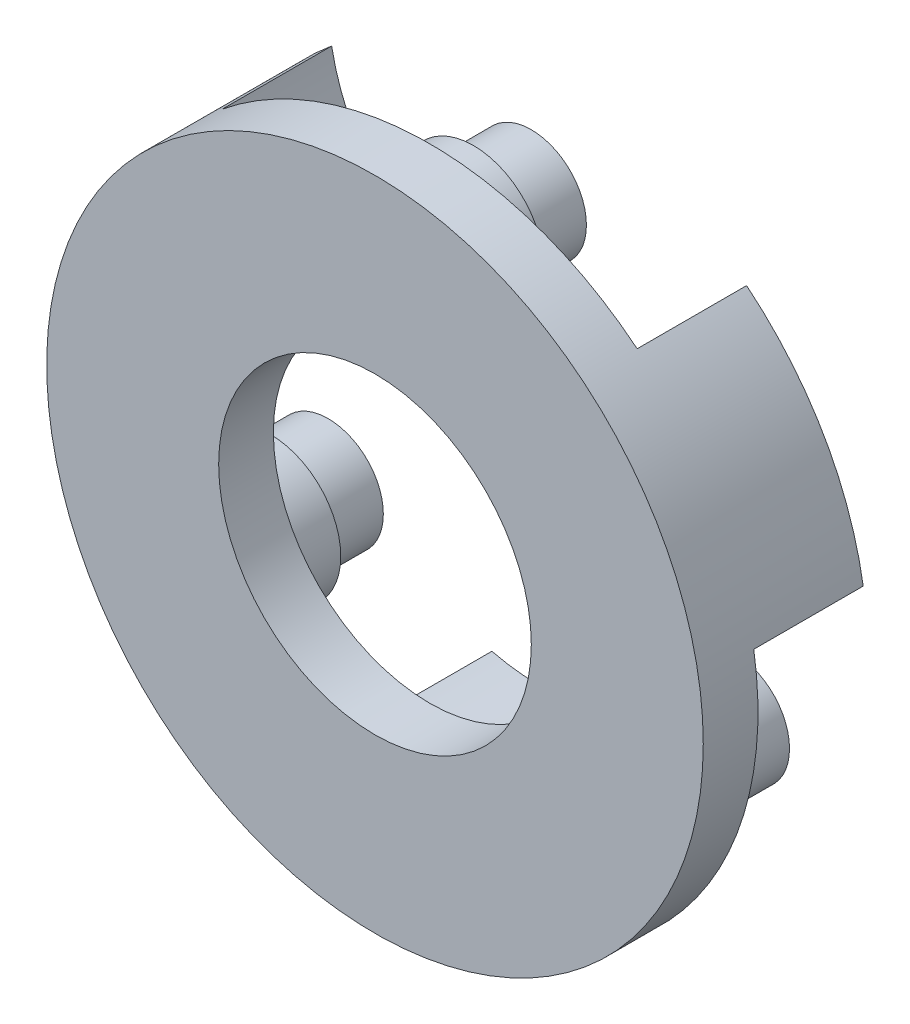
ISO-10303-21;
HEADER;
FILE_DESCRIPTION(('STEP AP214'),'2;1');
FILE_NAME('part.step','',(''),(''),'','','');
FILE_SCHEMA(('AUTOMOTIVE_DESIGN { 1 0 10303 214 1 1 1 1 }'));
ENDSEC;
DATA;
#1=APPLICATION_CONTEXT('core data for automotive mechanical design processes');
#2=APPLICATION_PROTOCOL_DEFINITION('international standard','automotive_design',2000,#1);
#3=PRODUCT_CONTEXT('',#1,'mechanical');
#4=PRODUCT('Part','Part','',(#3));
#5=PRODUCT_RELATED_PRODUCT_CATEGORY('part','',(#4));
#6=PRODUCT_DEFINITION_FORMATION('','',#4);
#7=PRODUCT_DEFINITION_CONTEXT('part definition',#1,'design');
#8=PRODUCT_DEFINITION('design','',#6,#7);
#9=PRODUCT_DEFINITION_SHAPE('','',#8);
#10=(LENGTH_UNIT() NAMED_UNIT(*) SI_UNIT(.MILLI.,.METRE.));
#11=(NAMED_UNIT(*) PLANE_ANGLE_UNIT() SI_UNIT($,.RADIAN.));
#12=(NAMED_UNIT(*) SI_UNIT($,.STERADIAN.) SOLID_ANGLE_UNIT());
#13=UNCERTAINTY_MEASURE_WITH_UNIT(LENGTH_MEASURE(1.E-05),#10,'distance_accuracy_value','');
#14=(GEOMETRIC_REPRESENTATION_CONTEXT(3) GLOBAL_UNCERTAINTY_ASSIGNED_CONTEXT((#13)) GLOBAL_UNIT_ASSIGNED_CONTEXT((#10,
#11,#12)) REPRESENTATION_CONTEXT('',''));
#15=CARTESIAN_POINT('',(0.,0.,0.));
#16=DIRECTION('',(0.,0.,1.));
#17=DIRECTION('',(1.,0.,0.));
#18=AXIS2_PLACEMENT_3D('',#15,#16,#17);
#19=CARTESIAN_POINT('',(0.,0.,0.));
#20=DIRECTION('',(0.,0.,1.));
#21=DIRECTION('',(1.,0.,0.));
#22=AXIS2_PLACEMENT_3D('',#19,#20,#21);
#23=PLANE('',#22);
#24=CARTESIAN_POINT('',(12.9903810567659,-7.50000000000036,0.));
#25=DIRECTION('',(0.,0.,1.));
#26=DIRECTION('',(1.,0.,0.));
#27=AXIS2_PLACEMENT_3D('',#24,#25,#26);
#28=CIRCLE('',#27,4.50000000000084);
#29=CARTESIAN_POINT('',(17.4903810567668,-7.50000000000036,0.));
#30=VERTEX_POINT('',#29);
#31=EDGE_CURVE('E11',#30,#30,#28,.F.);
#32=ORIENTED_EDGE('',*,*,#31,.F.);
#33=EDGE_LOOP('',(#32));
#34=FACE_BOUND('',#33,.T.);
#35=CARTESIAN_POINT('',(-12.9903810567672,-7.49999999999963,0.));
#36=DIRECTION('',(0.,0.,1.));
#37=DIRECTION('',(1.,0.,0.));
#38=AXIS2_PLACEMENT_3D('',#35,#36,#37);
#39=CIRCLE('',#38,4.50000000000057);
#40=CARTESIAN_POINT('',(-8.49038105676664,-7.49999999999963,0.));
#41=VERTEX_POINT('',#40);
#42=EDGE_CURVE('E245',#41,#41,#39,.F.);
#43=ORIENTED_EDGE('',*,*,#42,.F.);
#44=EDGE_LOOP('',(#43));
#45=FACE_BOUND('',#44,.T.);
#46=CARTESIAN_POINT('',(0.,15.,0.));
#47=DIRECTION('',(0.,0.,1.));
#48=DIRECTION('',(1.,0.,0.));
#49=AXIS2_PLACEMENT_3D('',#46,#47,#48);
#50=CIRCLE('',#49,4.5);
#51=CARTESIAN_POINT('',(4.5,15.,0.));
#52=VERTEX_POINT('',#51);
#53=EDGE_CURVE('E239',#52,#52,#50,.F.);
#54=ORIENTED_EDGE('',*,*,#53,.F.);
#55=EDGE_LOOP('',(#54));
#56=FACE_BOUND('',#55,.T.);
#57=CARTESIAN_POINT('',(0.,0.,0.));
#58=DIRECTION('',(0.,0.,-1.));
#59=DIRECTION('',(-1.,0.,0.));
#60=AXIS2_PLACEMENT_3D('',#57,#58,#59);
#61=CIRCLE('',#60,10.);
#62=CARTESIAN_POINT('',(-10.,0.,0.));
#63=VERTEX_POINT('',#62);
#64=EDGE_CURVE('E222',#63,#63,#61,.T.);
#65=ORIENTED_EDGE('',*,*,#64,.F.);
#66=EDGE_LOOP('',(#65));
#67=FACE_BOUND('',#66,.T.);
#68=CARTESIAN_POINT('',(0.,0.,0.));
#69=DIRECTION('',(0.,0.,-1.));
#70=DIRECTION('',(-1.,0.,0.));
#71=AXIS2_PLACEMENT_3D('',#68,#69,#70);
#72=CIRCLE('',#71,12.5);
#73=CARTESIAN_POINT('',(3.02191559121072,-12.1292219931699,0.));
#74=VERTEX_POINT('',#73);
#75=CARTESIAN_POINT('',(-3.02191559121221,-12.1292219931696,0.));
#76=VERTEX_POINT('',#75);
#77=EDGE_CURVE('E159',#74,#76,#72,.T.);
#78=ORIENTED_EDGE('',*,*,#77,.T.);
#79=CARTESIAN_POINT('',(-16.2379763209581,-9.37499999999878,0.));
#80=DIRECTION('',(0.,0.,-1.));
#81=DIRECTION('',(-1.,0.,0.));
#82=AXIS2_PLACEMENT_3D('',#79,#80,#81);
#83=CIRCLE('',#82,13.4999999999999);
#84=CARTESIAN_POINT('',(-7.45897050021628,-19.6306841214692,0.));
#85=VERTEX_POINT('',#84);
#86=EDGE_CURVE('E132',#76,#85,#83,.T.);
#87=ORIENTED_EDGE('',*,*,#86,.T.);
#88=CARTESIAN_POINT('',(0.,0.,0.));
#89=DIRECTION('',(0.,0.,1.));
#90=DIRECTION('',(1.,0.,0.));
#91=AXIS2_PLACEMENT_3D('',#88,#89,#90);
#92=CIRCLE('',#91,21.);
#93=CARTESIAN_POINT('',(-20.7301563929679,3.35568412147083,0.));
#94=VERTEX_POINT('',#93);
#95=EDGE_CURVE('E236',#94,#85,#92,.T.);
#96=ORIENTED_EDGE('',*,*,#95,.F.);
#97=CARTESIAN_POINT('',(-16.2379763209581,-9.37499999999878,0.));
#98=DIRECTION('',(0.,0.,-1.));
#99=DIRECTION('',(-1.,0.,0.));
#100=AXIS2_PLACEMENT_3D('',#97,#98,#99);
#101=CIRCLE('',#100,13.5);
#102=CARTESIAN_POINT('',(-12.0151721698315,3.44755532650412,0.));
#103=VERTEX_POINT('',#102);
#104=EDGE_CURVE('E61',#94,#103,#101,.T.);
#105=ORIENTED_EDGE('',*,*,#104,.T.);
#106=CARTESIAN_POINT('',(0.,0.,0.));
#107=DIRECTION('',(0.,0.,-1.));
#108=DIRECTION('',(-1.,0.,0.));
#109=AXIS2_PLACEMENT_3D('',#106,#107,#108);
#110=CIRCLE('',#109,12.5);
#111=CARTESIAN_POINT('',(-8.99325657861968,8.68166666666682,0.));
#112=VERTEX_POINT('',#111);
#113=EDGE_CURVE('E181',#103,#112,#110,.T.);
#114=ORIENTED_EDGE('',*,*,#113,.T.);
#115=CARTESIAN_POINT('',(1.09807996029332E-12,18.7499999999993,0.));
#116=DIRECTION('',(0.,0.,-1.));
#117=DIRECTION('',(-1.,0.,0.));
#118=AXIS2_PLACEMENT_3D('',#115,#116,#117);
#119=CIRCLE('',#118,13.5);
#120=CARTESIAN_POINT('',(-13.2711858927519,16.2750000000007,0.));
#121=VERTEX_POINT('',#120);
#122=EDGE_CURVE('E137',#112,#121,#119,.T.);
#123=ORIENTED_EDGE('',*,*,#122,.T.);
#124=CARTESIAN_POINT('',(13.2711858927538,16.2749999999991,0.));
#125=VERTEX_POINT('',#124);
#126=EDGE_CURVE('E233',#125,#121,#92,.T.);
#127=ORIENTED_EDGE('',*,*,#126,.F.);
#128=CARTESIAN_POINT('',(1.09807996029332E-12,18.7499999999993,0.));
#129=DIRECTION('',(0.,0.,-1.));
#130=DIRECTION('',(-1.,0.,0.));
#131=AXIS2_PLACEMENT_3D('',#128,#129,#130);
#132=CIRCLE('',#131,13.5);
#133=CARTESIAN_POINT('',(8.9932565786207,8.68166666666577,0.));
#134=VERTEX_POINT('',#133);
#135=EDGE_CURVE('E197',#125,#134,#132,.T.);
#136=ORIENTED_EDGE('',*,*,#135,.T.);
#137=CARTESIAN_POINT('',(0.,0.,0.));
#138=DIRECTION('',(0.,0.,-1.));
#139=DIRECTION('',(-1.,0.,0.));
#140=AXIS2_PLACEMENT_3D('',#137,#138,#139);
#141=CIRCLE('',#140,12.5);
#142=CARTESIAN_POINT('',(12.0151721698319,3.4475553265027,0.));
#143=VERTEX_POINT('',#142);
#144=EDGE_CURVE('E208',#134,#143,#141,.T.);
#145=ORIENTED_EDGE('',*,*,#144,.T.);
#146=CARTESIAN_POINT('',(16.237976320957,-9.37500000000068,0.));
#147=DIRECTION('',(0.,0.,-1.));
#148=DIRECTION('',(-1.,0.,0.));
#149=AXIS2_PLACEMENT_3D('',#146,#147,#148);
#150=CIRCLE('',#149,13.5);
#151=CARTESIAN_POINT('',(20.7301563929683,3.35568412146838,0.));
#152=VERTEX_POINT('',#151);
#153=EDGE_CURVE('E192',#143,#152,#150,.T.);
#154=ORIENTED_EDGE('',*,*,#153,.T.);
#155=CARTESIAN_POINT('',(7.45897050021399,-19.6306841214701,0.));
#156=VERTEX_POINT('',#155);
#157=EDGE_CURVE('E228',#156,#152,#92,.T.);
#158=ORIENTED_EDGE('',*,*,#157,.F.);
#159=CARTESIAN_POINT('',(16.237976320957,-9.37500000000068,0.));
#160=DIRECTION('',(0.,0.,-1.));
#161=DIRECTION('',(-1.,0.,0.));
#162=AXIS2_PLACEMENT_3D('',#159,#160,#161);
#163=CIRCLE('',#162,13.5);
#164=EDGE_CURVE('E53',#156,#74,#163,.T.);
#165=ORIENTED_EDGE('',*,*,#164,.T.);
#166=EDGE_LOOP('',(#78,#87,#96,#105,#114,#123,#127,#136,#145,#154,#158,#165));
#167=FACE_BOUND('',#166,.T.);
#168=ADVANCED_FACE('F38',(#34,#45,#56,#67,#167),#23,.F.);
#169=CARTESIAN_POINT('',(0.,0.,3.5));
#170=DIRECTION('',(0.,0.,-1.));
#171=DIRECTION('',(-1.,0.,0.));
#172=AXIS2_PLACEMENT_3D('',#169,#170,#171);
#173=CYLINDRICAL_SURFACE('',#172,21.);
#174=CARTESIAN_POINT('',(0.,0.,3.5));
#175=DIRECTION('',(0.,0.,1.));
#176=DIRECTION('',(1.,0.,0.));
#177=AXIS2_PLACEMENT_3D('',#174,#175,#176);
#178=CIRCLE('',#177,21.);
#179=CARTESIAN_POINT('',(21.,0.,3.5));
#180=VERTEX_POINT('',#179);
#181=EDGE_CURVE('E229',#180,#180,#178,.T.);
#182=ORIENTED_EDGE('',*,*,#181,.F.);
#183=EDGE_LOOP('',(#182));
#184=FACE_BOUND('',#183,.T.);
#185=ORIENTED_EDGE('',*,*,#126,.T.);
#186=DIRECTION('',(0.,0.,1.));
#187=VECTOR('',#186,1.);
#188=CARTESIAN_POINT('',(-13.2711858927519,16.2750000000007,-7.));
#189=LINE('',#188,#187);
#190=CARTESIAN_POINT('',(-13.2711858927519,16.2750000000007,-7.));
#191=VERTEX_POINT('',#190);
#192=EDGE_CURVE('E178',#191,#121,#189,.T.);
#193=ORIENTED_EDGE('',*,*,#192,.F.);
#194=CARTESIAN_POINT('',(0.,0.,-7.));
#195=DIRECTION('',(0.,0.,-1.));
#196=DIRECTION('',(-1.,0.,0.));
#197=AXIS2_PLACEMENT_3D('',#194,#195,#196);
#198=CIRCLE('',#197,21.);
#199=CARTESIAN_POINT('',(-20.7301563929679,3.35568412147083,-7.));
#200=VERTEX_POINT('',#199);
#201=EDGE_CURVE('E176',#200,#191,#198,.T.);
#202=ORIENTED_EDGE('',*,*,#201,.F.);
#203=DIRECTION('',(0.,0.,1.));
#204=VECTOR('',#203,1.);
#205=CARTESIAN_POINT('',(-20.7301563929679,3.35568412147083,-7.));
#206=LINE('',#205,#204);
#207=EDGE_CURVE('E186',#200,#94,#206,.T.);
#208=ORIENTED_EDGE('',*,*,#207,.T.);
#209=ORIENTED_EDGE('',*,*,#95,.T.);
#210=DIRECTION('',(0.,0.,1.));
#211=VECTOR('',#210,1.);
#212=CARTESIAN_POINT('',(-7.45897050021628,-19.6306841214692,-7.));
#213=LINE('',#212,#211);
#214=CARTESIAN_POINT('',(-7.45897050021628,-19.6306841214692,-7.));
#215=VERTEX_POINT('',#214);
#216=EDGE_CURVE('E157',#215,#85,#213,.T.);
#217=ORIENTED_EDGE('',*,*,#216,.F.);
#218=CARTESIAN_POINT('',(0.,0.,-7.));
#219=DIRECTION('',(0.,0.,-1.));
#220=DIRECTION('',(-1.,0.,0.));
#221=AXIS2_PLACEMENT_3D('',#218,#219,#220);
#222=CIRCLE('',#221,21.);
#223=CARTESIAN_POINT('',(7.45897050021399,-19.6306841214701,-7.));
#224=VERTEX_POINT('',#223);
#225=EDGE_CURVE('E147',#224,#215,#222,.T.);
#226=ORIENTED_EDGE('',*,*,#225,.F.);
#227=DIRECTION('',(0.,0.,1.));
#228=VECTOR('',#227,1.);
#229=CARTESIAN_POINT('',(7.45897050021399,-19.6306841214701,-7.));
#230=LINE('',#229,#228);
#231=EDGE_CURVE('E164',#224,#156,#230,.T.);
#232=ORIENTED_EDGE('',*,*,#231,.T.);
#233=ORIENTED_EDGE('',*,*,#157,.T.);
#234=DIRECTION('',(0.,0.,1.));
#235=VECTOR('',#234,1.);
#236=CARTESIAN_POINT('',(20.7301563929683,3.35568412146838,-7.));
#237=LINE('',#236,#235);
#238=CARTESIAN_POINT('',(20.7301563929683,3.35568412146838,-7.));
#239=VERTEX_POINT('',#238);
#240=EDGE_CURVE('E205',#239,#152,#237,.T.);
#241=ORIENTED_EDGE('',*,*,#240,.F.);
#242=CARTESIAN_POINT('',(0.,0.,-7.));
#243=DIRECTION('',(0.,0.,-1.));
#244=DIRECTION('',(-1.,0.,0.));
#245=AXIS2_PLACEMENT_3D('',#242,#243,#244);
#246=CIRCLE('',#245,21.);
#247=CARTESIAN_POINT('',(13.2711858927538,16.2749999999991,-7.));
#248=VERTEX_POINT('',#247);
#249=EDGE_CURVE('E203',#248,#239,#246,.T.);
#250=ORIENTED_EDGE('',*,*,#249,.F.);
#251=DIRECTION('',(0.,0.,1.));
#252=VECTOR('',#251,1.);
#253=CARTESIAN_POINT('',(13.2711858927538,16.2749999999991,-7.));
#254=LINE('',#253,#252);
#255=EDGE_CURVE('E215',#248,#125,#254,.T.);
#256=ORIENTED_EDGE('',*,*,#255,.T.);
#257=EDGE_LOOP('',(#185,#193,#202,#208,#209,#217,#226,#232,#233,#241,#250,#256));
#258=FACE_BOUND('',#257,.T.);
#259=ADVANCED_FACE('F40',(#184,#258),#173,.T.);
#260=CARTESIAN_POINT('',(0.,0.,3.5));
#261=DIRECTION('',(0.,0.,1.));
#262=DIRECTION('',(1.,0.,0.));
#263=AXIS2_PLACEMENT_3D('',#260,#261,#262);
#264=PLANE('',#263);
#265=CARTESIAN_POINT('',(0.,0.,3.5));
#266=DIRECTION('',(0.,0.,1.));
#267=DIRECTION('',(1.,0.,0.));
#268=AXIS2_PLACEMENT_3D('',#265,#266,#267);
#269=CIRCLE('',#268,10.);
#270=CARTESIAN_POINT('',(10.,0.,3.5));
#271=VERTEX_POINT('',#270);
#272=EDGE_CURVE('E225',#271,#271,#269,.T.);
#273=ORIENTED_EDGE('',*,*,#272,.F.);
#274=EDGE_LOOP('',(#273));
#275=FACE_BOUND('',#274,.T.);
#276=ORIENTED_EDGE('',*,*,#181,.T.);
#277=EDGE_LOOP('',(#276));
#278=FACE_BOUND('',#277,.T.);
#279=ADVANCED_FACE('F351',(#275,#278),#264,.T.);
#280=CARTESIAN_POINT('',(0.,0.,8.2));
#281=DIRECTION('',(0.,0.,-1.));
#282=DIRECTION('',(-1.,0.,0.));
#283=AXIS2_PLACEMENT_3D('',#280,#281,#282);
#284=CYLINDRICAL_SURFACE('',#283,10.);
#285=ORIENTED_EDGE('',*,*,#272,.T.);
#286=EDGE_LOOP('',(#285));
#287=FACE_BOUND('',#286,.T.);
#288=ORIENTED_EDGE('',*,*,#64,.T.);
#289=EDGE_LOOP('',(#288));
#290=FACE_BOUND('',#289,.T.);
#291=ADVANCED_FACE('F358',(#287,#290),#284,.F.);
#292=CARTESIAN_POINT('',(16.237976320957,-9.37500000000068,-7.));
#293=DIRECTION('',(0.,0.,1.));
#294=DIRECTION('',(1.,0.,0.));
#295=AXIS2_PLACEMENT_3D('',#292,#293,#294);
#296=CYLINDRICAL_SURFACE('',#295,13.5);
#297=ORIENTED_EDGE('',*,*,#153,.F.);
#298=DIRECTION('',(0.,0.,1.));
#299=VECTOR('',#298,1.);
#300=CARTESIAN_POINT('',(12.0151721698319,3.4475553265027,-7.));
#301=LINE('',#300,#299);
#302=CARTESIAN_POINT('',(12.0151721698319,3.4475553265027,-7.));
#303=VERTEX_POINT('',#302);
#304=EDGE_CURVE('E219',#303,#143,#301,.T.);
#305=ORIENTED_EDGE('',*,*,#304,.F.);
#306=CARTESIAN_POINT('',(16.237976320957,-9.37500000000068,-7.));
#307=DIRECTION('',(0.,0.,-1.));
#308=DIRECTION('',(-1.,0.,0.));
#309=AXIS2_PLACEMENT_3D('',#306,#307,#308);
#310=CIRCLE('',#309,13.5);
#311=EDGE_CURVE('E193',#303,#239,#310,.T.);
#312=ORIENTED_EDGE('',*,*,#311,.T.);
#313=ORIENTED_EDGE('',*,*,#240,.T.);
#314=EDGE_LOOP('',(#297,#305,#312,#313));
#315=FACE_BOUND('',#314,.T.);
#316=ADVANCED_FACE('F318',(#315),#296,.F.);
#317=CARTESIAN_POINT('',(0.,0.,-7.));
#318=DIRECTION('',(0.,0.,1.));
#319=DIRECTION('',(1.,0.,0.));
#320=AXIS2_PLACEMENT_3D('',#317,#318,#319);
#321=CYLINDRICAL_SURFACE('',#320,12.5);
#322=ORIENTED_EDGE('',*,*,#144,.F.);
#323=DIRECTION('',(0.,0.,1.));
#324=VECTOR('',#323,1.);
#325=CARTESIAN_POINT('',(8.9932565786207,8.68166666666577,-7.));
#326=LINE('',#325,#324);
#327=CARTESIAN_POINT('',(8.9932565786207,8.68166666666577,-7.));
#328=VERTEX_POINT('',#327);
#329=EDGE_CURVE('E217',#328,#134,#326,.T.);
#330=ORIENTED_EDGE('',*,*,#329,.F.);
#331=CARTESIAN_POINT('',(0.,0.,-7.));
#332=DIRECTION('',(0.,0.,-1.));
#333=DIRECTION('',(-1.,0.,0.));
#334=AXIS2_PLACEMENT_3D('',#331,#332,#333);
#335=CIRCLE('',#334,12.5);
#336=EDGE_CURVE('E196',#328,#303,#335,.T.);
#337=ORIENTED_EDGE('',*,*,#336,.T.);
#338=ORIENTED_EDGE('',*,*,#304,.T.);
#339=EDGE_LOOP('',(#322,#330,#337,#338));
#340=FACE_BOUND('',#339,.T.);
#341=ADVANCED_FACE('F312',(#340),#321,.F.);
#342=CARTESIAN_POINT('',(1.09807996029332E-12,18.7499999999993,-7.));
#343=DIRECTION('',(0.,0.,1.));
#344=DIRECTION('',(1.,0.,0.));
#345=AXIS2_PLACEMENT_3D('',#342,#343,#344);
#346=CYLINDRICAL_SURFACE('',#345,13.5);
#347=ORIENTED_EDGE('',*,*,#135,.F.);
#348=ORIENTED_EDGE('',*,*,#255,.F.);
#349=CARTESIAN_POINT('',(1.09807996029332E-12,18.7499999999993,-7.));
#350=DIRECTION('',(0.,0.,-1.));
#351=DIRECTION('',(-1.,0.,0.));
#352=AXIS2_PLACEMENT_3D('',#349,#350,#351);
#353=CIRCLE('',#352,13.5);
#354=EDGE_CURVE('E200',#248,#328,#353,.T.);
#355=ORIENTED_EDGE('',*,*,#354,.T.);
#356=ORIENTED_EDGE('',*,*,#329,.T.);
#357=EDGE_LOOP('',(#347,#348,#355,#356));
#358=FACE_BOUND('',#357,.T.);
#359=ADVANCED_FACE('F302',(#358),#346,.F.);
#360=CARTESIAN_POINT('',(0.,0.,-7.));
#361=DIRECTION('',(0.,0.,-1.));
#362=DIRECTION('',(-1.,0.,0.));
#363=AXIS2_PLACEMENT_3D('',#360,#361,#362);
#364=PLANE('',#363);
#365=CARTESIAN_POINT('',(13.8564064605515,7.99999999999844,-7.));
#366=DIRECTION('',(0.,0.,-1.));
#367=DIRECTION('',(-1.,0.,0.));
#368=AXIS2_PLACEMENT_3D('',#365,#366,#367);
#369=CIRCLE('',#368,1.50000000000057);
#370=CARTESIAN_POINT('',(12.3564064605509,7.99999999999844,-7.));
#371=VERTEX_POINT('',#370);
#372=EDGE_CURVE('E284',#371,#371,#369,.T.);
#373=ORIENTED_EDGE('',*,*,#372,.F.);
#374=EDGE_LOOP('',(#373));
#375=FACE_BOUND('',#374,.T.);
#376=ORIENTED_EDGE('',*,*,#311,.F.);
#377=ORIENTED_EDGE('',*,*,#336,.F.);
#378=ORIENTED_EDGE('',*,*,#354,.F.);
#379=ORIENTED_EDGE('',*,*,#249,.T.);
#380=EDGE_LOOP('',(#376,#377,#378,#379));
#381=FACE_BOUND('',#380,.T.);
#382=ADVANCED_FACE('F298',(#375,#381),#364,.T.);
#383=CARTESIAN_POINT('',(1.09807996029332E-12,18.7499999999993,-7.));
#384=DIRECTION('',(0.,0.,1.));
#385=DIRECTION('',(1.,0.,0.));
#386=AXIS2_PLACEMENT_3D('',#383,#384,#385);
#387=CYLINDRICAL_SURFACE('',#386,13.5);
#388=ORIENTED_EDGE('',*,*,#122,.F.);
#389=DIRECTION('',(0.,0.,1.));
#390=VECTOR('',#389,1.);
#391=CARTESIAN_POINT('',(-8.99325657861968,8.68166666666682,-7.));
#392=LINE('',#391,#390);
#393=CARTESIAN_POINT('',(-8.99325657861968,8.68166666666682,-7.));
#394=VERTEX_POINT('',#393);
#395=EDGE_CURVE('E190',#394,#112,#392,.T.);
#396=ORIENTED_EDGE('',*,*,#395,.F.);
#397=CARTESIAN_POINT('',(1.09807996029332E-12,18.7499999999993,-7.));
#398=DIRECTION('',(0.,0.,-1.));
#399=DIRECTION('',(-1.,0.,0.));
#400=AXIS2_PLACEMENT_3D('',#397,#398,#399);
#401=CIRCLE('',#400,13.5);
#402=EDGE_CURVE('E167',#394,#191,#401,.T.);
#403=ORIENTED_EDGE('',*,*,#402,.T.);
#404=ORIENTED_EDGE('',*,*,#192,.T.);
#405=EDGE_LOOP('',(#388,#396,#403,#404));
#406=FACE_BOUND('',#405,.T.);
#407=ADVANCED_FACE('F301',(#406),#387,.F.);
#408=CARTESIAN_POINT('',(0.,0.,-7.));
#409=DIRECTION('',(0.,0.,1.));
#410=DIRECTION('',(1.,0.,0.));
#411=AXIS2_PLACEMENT_3D('',#408,#409,#410);
#412=CYLINDRICAL_SURFACE('',#411,12.5);
#413=ORIENTED_EDGE('',*,*,#113,.F.);
#414=DIRECTION('',(0.,0.,1.));
#415=VECTOR('',#414,1.);
#416=CARTESIAN_POINT('',(-12.0151721698315,3.44755532650412,-7.));
#417=LINE('',#416,#415);
#418=CARTESIAN_POINT('',(-12.0151721698315,3.44755532650412,-7.));
#419=VERTEX_POINT('',#418);
#420=EDGE_CURVE('E188',#419,#103,#417,.T.);
#421=ORIENTED_EDGE('',*,*,#420,.F.);
#422=CARTESIAN_POINT('',(0.,0.,-7.));
#423=DIRECTION('',(0.,0.,-1.));
#424=DIRECTION('',(-1.,0.,0.));
#425=AXIS2_PLACEMENT_3D('',#422,#423,#424);
#426=CIRCLE('',#425,12.5);
#427=EDGE_CURVE('E170',#419,#394,#426,.T.);
#428=ORIENTED_EDGE('',*,*,#427,.T.);
#429=ORIENTED_EDGE('',*,*,#395,.T.);
#430=EDGE_LOOP('',(#413,#421,#428,#429));
#431=FACE_BOUND('',#430,.T.);
#432=ADVANCED_FACE('F331',(#431),#412,.F.);
#433=CARTESIAN_POINT('',(-16.2379763209581,-9.37499999999878,-7.));
#434=DIRECTION('',(0.,0.,1.));
#435=DIRECTION('',(1.,0.,0.));
#436=AXIS2_PLACEMENT_3D('',#433,#434,#435);
#437=CYLINDRICAL_SURFACE('',#436,13.5);
#438=ORIENTED_EDGE('',*,*,#104,.F.);
#439=ORIENTED_EDGE('',*,*,#207,.F.);
#440=CARTESIAN_POINT('',(-16.2379763209581,-9.37499999999878,-7.));
#441=DIRECTION('',(0.,0.,-1.));
#442=DIRECTION('',(-1.,0.,0.));
#443=AXIS2_PLACEMENT_3D('',#440,#441,#442);
#444=CIRCLE('',#443,13.5);
#445=EDGE_CURVE('E173',#200,#419,#444,.T.);
#446=ORIENTED_EDGE('',*,*,#445,.T.);
#447=ORIENTED_EDGE('',*,*,#420,.T.);
#448=EDGE_LOOP('',(#438,#439,#446,#447));
#449=FACE_BOUND('',#448,.T.);
#450=ADVANCED_FACE('F332',(#449),#437,.F.);
#451=CARTESIAN_POINT('',(0.,0.,-7.));
#452=DIRECTION('',(0.,0.,-1.));
#453=DIRECTION('',(-1.,0.,0.));
#454=AXIS2_PLACEMENT_3D('',#451,#452,#453);
#455=PLANE('',#454);
#456=CARTESIAN_POINT('',(-13.8564064605506,8.00000000000078,-7.));
#457=DIRECTION('',(0.,0.,-1.));
#458=DIRECTION('',(-1.,0.,0.));
#459=AXIS2_PLACEMENT_3D('',#456,#457,#458);
#460=CIRCLE('',#459,1.5);
#461=CARTESIAN_POINT('',(-15.3564064605506,8.00000000000078,-7.));
#462=VERTEX_POINT('',#461);
#463=EDGE_CURVE('E275',#462,#462,#460,.T.);
#464=ORIENTED_EDGE('',*,*,#463,.F.);
#465=EDGE_LOOP('',(#464));
#466=FACE_BOUND('',#465,.T.);
#467=ORIENTED_EDGE('',*,*,#402,.F.);
#468=ORIENTED_EDGE('',*,*,#427,.F.);
#469=ORIENTED_EDGE('',*,*,#445,.F.);
#470=ORIENTED_EDGE('',*,*,#201,.T.);
#471=EDGE_LOOP('',(#467,#468,#469,#470));
#472=FACE_BOUND('',#471,.T.);
#473=ADVANCED_FACE('F328',(#466,#472),#455,.T.);
#474=CARTESIAN_POINT('',(-16.2379763209581,-9.37499999999878,-7.));
#475=DIRECTION('',(0.,0.,1.));
#476=DIRECTION('',(1.,0.,0.));
#477=AXIS2_PLACEMENT_3D('',#474,#475,#476);
#478=CYLINDRICAL_SURFACE('',#477,13.4999999999999);
#479=ORIENTED_EDGE('',*,*,#86,.F.);
#480=DIRECTION('',(0.,0.,1.));
#481=VECTOR('',#480,1.);
#482=CARTESIAN_POINT('',(-3.02191559121221,-12.1292219931696,-7.));
#483=LINE('',#482,#481);
#484=CARTESIAN_POINT('',(-3.02191559121221,-12.1292219931696,-7.));
#485=VERTEX_POINT('',#484);
#486=EDGE_CURVE('E127',#485,#76,#483,.T.);
#487=ORIENTED_EDGE('',*,*,#486,.F.);
#488=CARTESIAN_POINT('',(-16.2379763209581,-9.37499999999878,-7.));
#489=DIRECTION('',(0.,0.,-1.));
#490=DIRECTION('',(-1.,0.,0.));
#491=AXIS2_PLACEMENT_3D('',#488,#489,#490);
#492=CIRCLE('',#491,13.4999999999999);
#493=EDGE_CURVE('E130',#485,#215,#492,.T.);
#494=ORIENTED_EDGE('',*,*,#493,.T.);
#495=ORIENTED_EDGE('',*,*,#216,.T.);
#496=EDGE_LOOP('',(#479,#487,#494,#495));
#497=FACE_BOUND('',#496,.T.);
#498=ADVANCED_FACE('F129',(#497),#478,.F.);
#499=CARTESIAN_POINT('',(0.,0.,-7.));
#500=DIRECTION('',(0.,0.,1.));
#501=DIRECTION('',(1.,0.,0.));
#502=AXIS2_PLACEMENT_3D('',#499,#500,#501);
#503=CYLINDRICAL_SURFACE('',#502,12.5);
#504=ORIENTED_EDGE('',*,*,#77,.F.);
#505=DIRECTION('',(0.,0.,1.));
#506=VECTOR('',#505,1.);
#507=CARTESIAN_POINT('',(3.02191559121072,-12.1292219931699,-7.));
#508=LINE('',#507,#506);
#509=CARTESIAN_POINT('',(3.02191559121072,-12.1292219931699,-7.));
#510=VERTEX_POINT('',#509);
#511=EDGE_CURVE('E138',#510,#74,#508,.T.);
#512=ORIENTED_EDGE('',*,*,#511,.F.);
#513=CARTESIAN_POINT('',(0.,0.,-7.));
#514=DIRECTION('',(0.,0.,-1.));
#515=DIRECTION('',(-1.,0.,0.));
#516=AXIS2_PLACEMENT_3D('',#513,#514,#515);
#517=CIRCLE('',#516,12.5);
#518=EDGE_CURVE('E144',#510,#485,#517,.T.);
#519=ORIENTED_EDGE('',*,*,#518,.T.);
#520=ORIENTED_EDGE('',*,*,#486,.T.);
#521=EDGE_LOOP('',(#504,#512,#519,#520));
#522=FACE_BOUND('',#521,.T.);
#523=ADVANCED_FACE('F150',(#522),#503,.F.);
#524=CARTESIAN_POINT('',(16.237976320957,-9.37500000000068,-7.));
#525=DIRECTION('',(0.,0.,1.));
#526=DIRECTION('',(1.,0.,0.));
#527=AXIS2_PLACEMENT_3D('',#524,#525,#526);
#528=CYLINDRICAL_SURFACE('',#527,13.5);
#529=ORIENTED_EDGE('',*,*,#164,.F.);
#530=ORIENTED_EDGE('',*,*,#231,.F.);
#531=CARTESIAN_POINT('',(16.237976320957,-9.37500000000068,-7.));
#532=DIRECTION('',(0.,0.,-1.));
#533=DIRECTION('',(-1.,0.,0.));
#534=AXIS2_PLACEMENT_3D('',#531,#532,#533);
#535=CIRCLE('',#534,13.5);
#536=EDGE_CURVE('E151',#224,#510,#535,.T.);
#537=ORIENTED_EDGE('',*,*,#536,.T.);
#538=ORIENTED_EDGE('',*,*,#511,.T.);
#539=EDGE_LOOP('',(#529,#530,#537,#538));
#540=FACE_BOUND('',#539,.T.);
#541=ADVANCED_FACE('F335',(#540),#528,.F.);
#542=CARTESIAN_POINT('',(0.,0.,-7.));
#543=DIRECTION('',(0.,0.,-1.));
#544=DIRECTION('',(-1.,0.,0.));
#545=AXIS2_PLACEMENT_3D('',#542,#543,#544);
#546=PLANE('',#545);
#547=CARTESIAN_POINT('',(-1.58372237557348E-12,-16.0000000000004,-7.));
#548=DIRECTION('',(0.,0.,-1.));
#549=DIRECTION('',(-1.,0.,0.));
#550=AXIS2_PLACEMENT_3D('',#547,#548,#549);
#551=CIRCLE('',#550,1.4999999999998);
#552=CARTESIAN_POINT('',(-1.50000000000138,-16.0000000000004,-7.));
#553=VERTEX_POINT('',#552);
#554=EDGE_CURVE('E278',#553,#553,#551,.T.);
#555=ORIENTED_EDGE('',*,*,#554,.F.);
#556=EDGE_LOOP('',(#555));
#557=FACE_BOUND('',#556,.T.);
#558=ORIENTED_EDGE('',*,*,#493,.F.);
#559=ORIENTED_EDGE('',*,*,#518,.F.);
#560=ORIENTED_EDGE('',*,*,#536,.F.);
#561=ORIENTED_EDGE('',*,*,#225,.T.);
#562=EDGE_LOOP('',(#558,#559,#560,#561));
#563=FACE_BOUND('',#562,.T.);
#564=ADVANCED_FACE('F142',(#557,#563),#546,.T.);
#565=CARTESIAN_POINT('',(-1.58372237557348E-12,-16.0000000000004,-2.));
#566=DIRECTION('',(0.,0.,-1.));
#567=DIRECTION('',(-1.,0.,0.));
#568=AXIS2_PLACEMENT_3D('',#565,#566,#567);
#569=CYLINDRICAL_SURFACE('',#568,1.4999999999998);
#570=CARTESIAN_POINT('',(-1.58372237557348E-12,-16.0000000000004,-2.));
#571=DIRECTION('',(0.,0.,-1.));
#572=DIRECTION('',(-1.,0.,0.));
#573=AXIS2_PLACEMENT_3D('',#570,#571,#572);
#574=CIRCLE('',#573,1.4999999999998);
#575=CARTESIAN_POINT('',(-1.50000000000138,-16.0000000000004,-2.));
#576=VERTEX_POINT('',#575);
#577=EDGE_CURVE('E281',#576,#576,#574,.T.);
#578=ORIENTED_EDGE('',*,*,#577,.F.);
#579=EDGE_LOOP('',(#578));
#580=FACE_BOUND('',#579,.T.);
#581=ORIENTED_EDGE('',*,*,#554,.T.);
#582=EDGE_LOOP('',(#581));
#583=FACE_BOUND('',#582,.T.);
#584=ADVANCED_FACE('F342',(#580,#583),#569,.F.);
#585=CARTESIAN_POINT('',(-1.58372237557348E-12,-16.0000000000004,-2.));
#586=DIRECTION('',(0.,0.,-1.));
#587=DIRECTION('',(-1.,0.,0.));
#588=AXIS2_PLACEMENT_3D('',#585,#586,#587);
#589=PLANE('',#588);
#590=ORIENTED_EDGE('',*,*,#577,.T.);
#591=EDGE_LOOP('',(#590));
#592=FACE_BOUND('',#591,.T.);
#593=ADVANCED_FACE('F425',(#592),#589,.T.);
#594=CARTESIAN_POINT('',(-13.8564064605506,8.00000000000078,-2.));
#595=DIRECTION('',(0.,0.,-1.));
#596=DIRECTION('',(-1.,0.,0.));
#597=AXIS2_PLACEMENT_3D('',#594,#595,#596);
#598=CYLINDRICAL_SURFACE('',#597,1.5);
#599=CARTESIAN_POINT('',(-13.8564064605506,8.00000000000078,-2.));
#600=DIRECTION('',(0.,0.,-1.));
#601=DIRECTION('',(-1.,0.,0.));
#602=AXIS2_PLACEMENT_3D('',#599,#600,#601);
#603=CIRCLE('',#602,1.5);
#604=CARTESIAN_POINT('',(-15.3564064605506,8.00000000000078,-2.));
#605=VERTEX_POINT('',#604);
#606=EDGE_CURVE('E160',#605,#605,#603,.T.);
#607=ORIENTED_EDGE('',*,*,#606,.F.);
#608=EDGE_LOOP('',(#607));
#609=FACE_BOUND('',#608,.T.);
#610=ORIENTED_EDGE('',*,*,#463,.T.);
#611=EDGE_LOOP('',(#610));
#612=FACE_BOUND('',#611,.T.);
#613=ADVANCED_FACE('F436',(#609,#612),#598,.F.);
#614=CARTESIAN_POINT('',(-13.8564064605506,8.00000000000078,-2.));
#615=DIRECTION('',(0.,0.,-1.));
#616=DIRECTION('',(-1.,0.,0.));
#617=AXIS2_PLACEMENT_3D('',#614,#615,#616);
#618=PLANE('',#617);
#619=ORIENTED_EDGE('',*,*,#606,.T.);
#620=EDGE_LOOP('',(#619));
#621=FACE_BOUND('',#620,.T.);
#622=ADVANCED_FACE('F294',(#621),#618,.T.);
#623=CARTESIAN_POINT('',(13.8564064605515,7.99999999999844,-2.));
#624=DIRECTION('',(0.,0.,-1.));
#625=DIRECTION('',(-1.,0.,0.));
#626=AXIS2_PLACEMENT_3D('',#623,#624,#625);
#627=CYLINDRICAL_SURFACE('',#626,1.50000000000057);
#628=CARTESIAN_POINT('',(13.8564064605515,7.99999999999844,-2.));
#629=DIRECTION('',(0.,0.,-1.));
#630=DIRECTION('',(-1.,0.,0.));
#631=AXIS2_PLACEMENT_3D('',#628,#629,#630);
#632=CIRCLE('',#631,1.50000000000057);
#633=CARTESIAN_POINT('',(12.3564064605509,7.99999999999844,-2.));
#634=VERTEX_POINT('',#633);
#635=EDGE_CURVE('E266',#634,#634,#632,.T.);
#636=ORIENTED_EDGE('',*,*,#635,.F.);
#637=EDGE_LOOP('',(#636));
#638=FACE_BOUND('',#637,.T.);
#639=ORIENTED_EDGE('',*,*,#372,.T.);
#640=EDGE_LOOP('',(#639));
#641=FACE_BOUND('',#640,.T.);
#642=ADVANCED_FACE('F291',(#638,#641),#627,.F.);
#643=CARTESIAN_POINT('',(13.8564064605515,7.99999999999844,-2.));
#644=DIRECTION('',(0.,0.,-1.));
#645=DIRECTION('',(-1.,0.,0.));
#646=AXIS2_PLACEMENT_3D('',#643,#644,#645);
#647=PLANE('',#646);
#648=ORIENTED_EDGE('',*,*,#635,.T.);
#649=EDGE_LOOP('',(#648));
#650=FACE_BOUND('',#649,.T.);
#651=ADVANCED_FACE('F289',(#650),#647,.T.);
#652=CARTESIAN_POINT('',(0.,15.,-2.8));
#653=DIRECTION('',(0.,0.,1.));
#654=DIRECTION('',(1.,0.,0.));
#655=AXIS2_PLACEMENT_3D('',#652,#653,#654);
#656=CYLINDRICAL_SURFACE('',#655,4.5);
#657=CARTESIAN_POINT('',(0.,15.,-2.8));
#658=DIRECTION('',(0.,0.,-1.));
#659=DIRECTION('',(-1.,0.,0.));
#660=AXIS2_PLACEMENT_3D('',#657,#658,#659);
#661=CIRCLE('',#660,4.5);
#662=CARTESIAN_POINT('',(-4.5,15.,-2.8));
#663=VERTEX_POINT('',#662);
#664=EDGE_CURVE('E269',#663,#663,#661,.T.);
#665=ORIENTED_EDGE('',*,*,#664,.F.);
#666=EDGE_LOOP('',(#665));
#667=FACE_BOUND('',#666,.T.);
#668=ORIENTED_EDGE('',*,*,#53,.T.);
#669=EDGE_LOOP('',(#668));
#670=FACE_BOUND('',#669,.T.);
#671=ADVANCED_FACE('F474',(#667,#670),#656,.T.);
#672=CARTESIAN_POINT('',(0.,15.,-2.8));
#673=DIRECTION('',(0.,0.,-1.));
#674=DIRECTION('',(-1.,0.,0.));
#675=AXIS2_PLACEMENT_3D('',#672,#673,#674);
#676=PLANE('',#675);
#677=CARTESIAN_POINT('',(0.,15.,-2.8));
#678=DIRECTION('',(0.,0.,-1.));
#679=DIRECTION('',(-1.,0.,0.));
#680=AXIS2_PLACEMENT_3D('',#677,#678,#679);
#681=CIRCLE('',#680,3.525);
#682=CARTESIAN_POINT('',(-3.525,15.,-2.8));
#683=VERTEX_POINT('',#682);
#684=EDGE_CURVE('E232',#683,#683,#681,.F.);
#685=ORIENTED_EDGE('',*,*,#684,.T.);
#686=EDGE_LOOP('',(#685));
#687=FACE_BOUND('',#686,.T.);
#688=ORIENTED_EDGE('',*,*,#664,.T.);
#689=EDGE_LOOP('',(#688));
#690=FACE_BOUND('',#689,.T.);
#691=ADVANCED_FACE('F496',(#687,#690),#676,.T.);
#692=CARTESIAN_POINT('',(0.,15.,-6.5));
#693=DIRECTION('',(0.,0.,1.));
#694=DIRECTION('',(1.,0.,0.));
#695=AXIS2_PLACEMENT_3D('',#692,#693,#694);
#696=PLANE('',#695);
#697=CARTESIAN_POINT('',(0.,15.,-6.5));
#698=DIRECTION('',(0.,0.,1.));
#699=DIRECTION('',(1.,0.,0.));
#700=AXIS2_PLACEMENT_3D('',#697,#698,#699);
#701=CIRCLE('',#700,3.525);
#702=CARTESIAN_POINT('',(3.525,15.,-6.5));
#703=VERTEX_POINT('',#702);
#704=EDGE_CURVE('E262',#703,#703,#701,.T.);
#705=ORIENTED_EDGE('',*,*,#704,.F.);
#706=EDGE_LOOP('',(#705));
#707=FACE_BOUND('',#706,.T.);
#708=ADVANCED_FACE('F490',(#707),#696,.F.);
#709=CARTESIAN_POINT('',(0.,15.,-6.5));
#710=DIRECTION('',(0.,0.,1.));
#711=DIRECTION('',(1.,0.,0.));
#712=AXIS2_PLACEMENT_3D('',#709,#710,#711);
#713=CYLINDRICAL_SURFACE('',#712,3.525);
#714=ORIENTED_EDGE('',*,*,#684,.F.);
#715=EDGE_LOOP('',(#714));
#716=FACE_BOUND('',#715,.T.);
#717=ORIENTED_EDGE('',*,*,#704,.T.);
#718=EDGE_LOOP('',(#717));
#719=FACE_BOUND('',#718,.T.);
#720=ADVANCED_FACE('F495',(#716,#719),#713,.T.);
#721=CARTESIAN_POINT('',(-12.9903810567672,-7.49999999999963,-2.8));
#722=DIRECTION('',(0.,0.,1.));
#723=DIRECTION('',(1.,0.,0.));
#724=AXIS2_PLACEMENT_3D('',#721,#722,#723);
#725=CYLINDRICAL_SURFACE('',#724,4.50000000000057);
#726=CARTESIAN_POINT('',(-12.9903810567672,-7.49999999999963,-2.8));
#727=DIRECTION('',(0.,0.,-1.));
#728=DIRECTION('',(-1.,0.,0.));
#729=AXIS2_PLACEMENT_3D('',#726,#727,#728);
#730=CIRCLE('',#729,4.50000000000057);
#731=CARTESIAN_POINT('',(-17.4903810567678,-7.49999999999963,-2.8));
#732=VERTEX_POINT('',#731);
#733=EDGE_CURVE('E734',#732,#732,#730,.T.);
#734=ORIENTED_EDGE('',*,*,#733,.F.);
#735=EDGE_LOOP('',(#734));
#736=FACE_BOUND('',#735,.T.);
#737=ORIENTED_EDGE('',*,*,#42,.T.);
#738=EDGE_LOOP('',(#737));
#739=FACE_BOUND('',#738,.T.);
#740=ADVANCED_FACE('F559',(#736,#739),#725,.T.);
#741=CARTESIAN_POINT('',(-12.9903810567672,-7.49999999999963,-2.8));
#742=DIRECTION('',(0.,0.,-1.));
#743=DIRECTION('',(-1.,0.,0.));
#744=AXIS2_PLACEMENT_3D('',#741,#742,#743);
#745=PLANE('',#744);
#746=CARTESIAN_POINT('',(-12.9903810567656,-7.50000000000055,-2.8));
#747=DIRECTION('',(0.,0.,-1.));
#748=DIRECTION('',(-1.,0.,0.));
#749=AXIS2_PLACEMENT_3D('',#746,#747,#748);
#750=CIRCLE('',#749,3.525);
#751=CARTESIAN_POINT('',(-16.5153810567656,-7.50000000000055,-2.8));
#752=VERTEX_POINT('',#751);
#753=EDGE_CURVE('E242',#752,#752,#750,.F.);
#754=ORIENTED_EDGE('',*,*,#753,.T.);
#755=EDGE_LOOP('',(#754));
#756=FACE_BOUND('',#755,.T.);
#757=ORIENTED_EDGE('',*,*,#733,.T.);
#758=EDGE_LOOP('',(#757));
#759=FACE_BOUND('',#758,.T.);
#760=ADVANCED_FACE('F522',(#756,#759),#745,.T.);
#761=CARTESIAN_POINT('',(-12.9903810567656,-7.50000000000055,-6.5));
#762=DIRECTION('',(0.,0.,1.));
#763=DIRECTION('',(1.,0.,0.));
#764=AXIS2_PLACEMENT_3D('',#761,#762,#763);
#765=PLANE('',#764);
#766=CARTESIAN_POINT('',(-12.9903810567656,-7.50000000000055,-6.5));
#767=DIRECTION('',(0.,0.,1.));
#768=DIRECTION('',(1.,0.,0.));
#769=AXIS2_PLACEMENT_3D('',#766,#767,#768);
#770=CIRCLE('',#769,3.525);
#771=CARTESIAN_POINT('',(-9.46538105676563,-7.50000000000055,-6.5));
#772=VERTEX_POINT('',#771);
#773=EDGE_CURVE('E263',#772,#772,#770,.T.);
#774=ORIENTED_EDGE('',*,*,#773,.F.);
#775=EDGE_LOOP('',(#774));
#776=FACE_BOUND('',#775,.T.);
#777=ADVANCED_FACE('F517',(#776),#765,.F.);
#778=CARTESIAN_POINT('',(-12.9903810567656,-7.50000000000055,-6.5));
#779=DIRECTION('',(0.,0.,1.));
#780=DIRECTION('',(1.,0.,0.));
#781=AXIS2_PLACEMENT_3D('',#778,#779,#780);
#782=CYLINDRICAL_SURFACE('',#781,3.525);
#783=ORIENTED_EDGE('',*,*,#753,.F.);
#784=EDGE_LOOP('',(#783));
#785=FACE_BOUND('',#784,.T.);
#786=ORIENTED_EDGE('',*,*,#773,.T.);
#787=EDGE_LOOP('',(#786));
#788=FACE_BOUND('',#787,.T.);
#789=ADVANCED_FACE('F521',(#785,#788),#782,.T.);
#790=CARTESIAN_POINT('',(12.9903810567659,-7.50000000000036,-2.8));
#791=DIRECTION('',(0.,0.,1.));
#792=DIRECTION('',(1.,0.,0.));
#793=AXIS2_PLACEMENT_3D('',#790,#791,#792);
#794=CYLINDRICAL_SURFACE('',#793,4.50000000000084);
#795=CARTESIAN_POINT('',(12.9903810567659,-7.50000000000036,-2.8));
#796=DIRECTION('',(0.,0.,-1.));
#797=DIRECTION('',(-1.,0.,0.));
#798=AXIS2_PLACEMENT_3D('',#795,#796,#797);
#799=CIRCLE('',#798,4.50000000000084);
#800=CARTESIAN_POINT('',(8.49038105676511,-7.50000000000036,-2.8));
#801=VERTEX_POINT('',#800);
#802=EDGE_CURVE('E733',#801,#801,#799,.T.);
#803=ORIENTED_EDGE('',*,*,#802,.F.);
#804=EDGE_LOOP('',(#803));
#805=FACE_BOUND('',#804,.T.);
#806=ORIENTED_EDGE('',*,*,#31,.T.);
#807=EDGE_LOOP('',(#806));
#808=FACE_BOUND('',#807,.T.);
#809=ADVANCED_FACE('F587',(#805,#808),#794,.T.);
#810=CARTESIAN_POINT('',(12.9903810567659,-7.50000000000036,-2.8));
#811=DIRECTION('',(0.,0.,-1.));
#812=DIRECTION('',(-1.,0.,0.));
#813=AXIS2_PLACEMENT_3D('',#810,#811,#812);
#814=PLANE('',#813);
#815=CARTESIAN_POINT('',(12.9903810567675,-7.49999999999945,-2.8));
#816=DIRECTION('',(0.,0.,-1.));
#817=DIRECTION('',(-1.,0.,0.));
#818=AXIS2_PLACEMENT_3D('',#815,#816,#817);
#819=CIRCLE('',#818,3.525);
#820=CARTESIAN_POINT('',(9.46538105676753,-7.49999999999945,-2.8));
#821=VERTEX_POINT('',#820);
#822=EDGE_CURVE('E46',#821,#821,#819,.F.);
#823=ORIENTED_EDGE('',*,*,#822,.T.);
#824=EDGE_LOOP('',(#823));
#825=FACE_BOUND('',#824,.T.);
#826=ORIENTED_EDGE('',*,*,#802,.T.);
#827=EDGE_LOOP('',(#826));
#828=FACE_BOUND('',#827,.T.);
#829=ADVANCED_FACE('F250',(#825,#828),#814,.T.);
#830=CARTESIAN_POINT('',(12.9903810567675,-7.49999999999945,-6.5));
#831=DIRECTION('',(0.,0.,1.));
#832=DIRECTION('',(1.,0.,0.));
#833=AXIS2_PLACEMENT_3D('',#830,#831,#832);
#834=PLANE('',#833);
#835=CARTESIAN_POINT('',(12.9903810567675,-7.49999999999945,-6.5));
#836=DIRECTION('',(0.,0.,1.));
#837=DIRECTION('',(1.,0.,0.));
#838=AXIS2_PLACEMENT_3D('',#835,#836,#837);
#839=CIRCLE('',#838,3.525);
#840=CARTESIAN_POINT('',(16.5153810567675,-7.49999999999945,-6.5));
#841=VERTEX_POINT('',#840);
#842=EDGE_CURVE('E260',#841,#841,#839,.T.);
#843=ORIENTED_EDGE('',*,*,#842,.F.);
#844=EDGE_LOOP('',(#843));
#845=FACE_BOUND('',#844,.T.);
#846=ADVANCED_FACE('F256',(#845),#834,.F.);
#847=CARTESIAN_POINT('',(12.9903810567675,-7.49999999999945,-6.5));
#848=DIRECTION('',(0.,0.,1.));
#849=DIRECTION('',(1.,0.,0.));
#850=AXIS2_PLACEMENT_3D('',#847,#848,#849);
#851=CYLINDRICAL_SURFACE('',#850,3.525);
#852=ORIENTED_EDGE('',*,*,#822,.F.);
#853=EDGE_LOOP('',(#852));
#854=FACE_BOUND('',#853,.T.);
#855=ORIENTED_EDGE('',*,*,#842,.T.);
#856=EDGE_LOOP('',(#855));
#857=FACE_BOUND('',#856,.T.);
#858=ADVANCED_FACE('F253',(#854,#857),#851,.T.);
#859=CLOSED_SHELL('',(#168,#259,#279,#291,#316,#341,#359,#382,#407,#432,#450,#473,#498,#523,
#541,#564,#584,#593,#613,#622,#642,#651,#671,#691,#708,#720,#740,#760,#777,#789,#809,#829,#846,#858));
#860=MANIFOLD_SOLID_BREP('B2',#859);
#861=ADVANCED_BREP_SHAPE_REPRESENTATION('',(#18,#860),#14);
#862=SHAPE_DEFINITION_REPRESENTATION(#9,#861);
ENDSEC;
END-ISO-10303-21;
